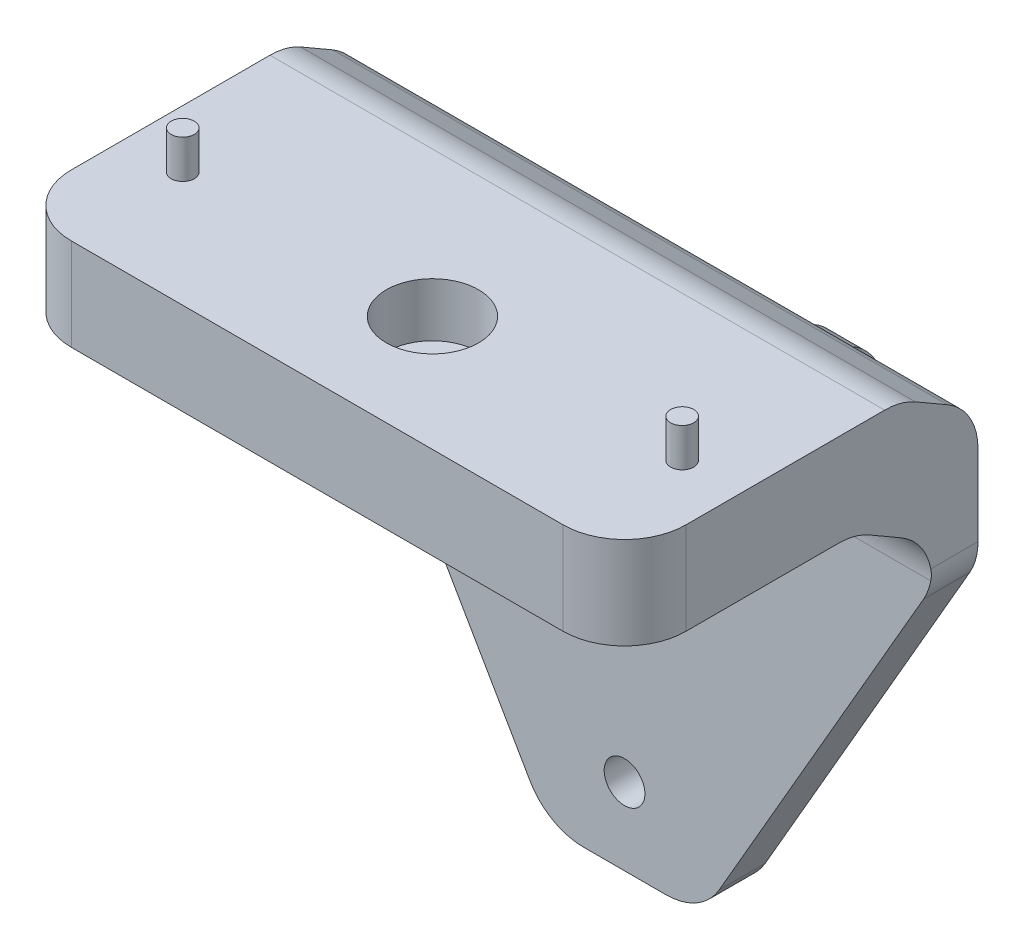
ISO-10303-21;
HEADER;
FILE_DESCRIPTION(('STEP AP214'),'2;1');
FILE_NAME('part.step','',(''),(''),'','','');
FILE_SCHEMA(('AUTOMOTIVE_DESIGN { 1 0 10303 214 1 1 1 1 }'));
ENDSEC;
DATA;
#1=APPLICATION_CONTEXT('core data for automotive mechanical design processes');
#2=APPLICATION_PROTOCOL_DEFINITION('international standard','automotive_design',2000,#1);
#3=PRODUCT_CONTEXT('',#1,'mechanical');
#4=PRODUCT('Part','Part','',(#3));
#5=PRODUCT_RELATED_PRODUCT_CATEGORY('part','',(#4));
#6=PRODUCT_DEFINITION_FORMATION('','',#4);
#7=PRODUCT_DEFINITION_CONTEXT('part definition',#1,'design');
#8=PRODUCT_DEFINITION('design','',#6,#7);
#9=PRODUCT_DEFINITION_SHAPE('','',#8);
#10=(LENGTH_UNIT() NAMED_UNIT(*) SI_UNIT(.MILLI.,.METRE.));
#11=(NAMED_UNIT(*) PLANE_ANGLE_UNIT() SI_UNIT($,.RADIAN.));
#12=(NAMED_UNIT(*) SI_UNIT($,.STERADIAN.) SOLID_ANGLE_UNIT());
#13=UNCERTAINTY_MEASURE_WITH_UNIT(LENGTH_MEASURE(1.E-05),#10,'distance_accuracy_value','');
#14=(GEOMETRIC_REPRESENTATION_CONTEXT(3) GLOBAL_UNCERTAINTY_ASSIGNED_CONTEXT((#13)) GLOBAL_UNIT_ASSIGNED_CONTEXT((#10,
#11,#12)) REPRESENTATION_CONTEXT('',''));
#15=CARTESIAN_POINT('',(0.,0.,0.));
#16=DIRECTION('',(0.,0.,1.));
#17=DIRECTION('',(1.,0.,0.));
#18=AXIS2_PLACEMENT_3D('',#15,#16,#17);
#19=CARTESIAN_POINT('',(40.,-63.,-46.));
#20=DIRECTION('',(0.,0.,1.));
#21=DIRECTION('',(1.,0.,0.));
#22=AXIS2_PLACEMENT_3D('',#19,#20,#21);
#23=PLANE('',#22);
#24=DIRECTION('',(0.500000000000001,-0.866025403784438,0.));
#25=VECTOR('',#24,1.);
#26=CARTESIAN_POINT('',(-9.99999999999993,-63.,-46.));
#27=LINE('',#26,#25);
#28=CARTESIAN_POINT('',(-12.3094010767584,-59.,-46.));
#29=VERTEX_POINT('',#28);
#30=CARTESIAN_POINT('',(-38.9282032302755,-12.8948822334847,-46.));
#31=VERTEX_POINT('',#30);
#32=EDGE_CURVE('E328',#29,#31,#27,.F.);
#33=ORIENTED_EDGE('',*,*,#32,.T.);
#34=CARTESIAN_POINT('',(-32.,-8.89488223348473,-46.));
#35=DIRECTION('',(0.,0.,1.));
#36=DIRECTION('',(1.,0.,0.));
#37=AXIS2_PLACEMENT_3D('',#34,#35,#36);
#38=CIRCLE('',#37,8.);
#39=CARTESIAN_POINT('',(-40.,-8.89488223348473,-46.));
#40=VERTEX_POINT('',#39);
#41=EDGE_CURVE('E648',#31,#40,#38,.F.);
#42=ORIENTED_EDGE('',*,*,#41,.T.);
#43=DIRECTION('',(0.,1.,0.));
#44=VECTOR('',#43,1.);
#45=CARTESIAN_POINT('',(-40.,-63.,-46.));
#46=LINE('',#45,#44);
#47=CARTESIAN_POINT('',(-40.,1.60769515458671,-46.));
#48=VERTEX_POINT('',#47);
#49=EDGE_CURVE('E300',#40,#48,#46,.T.);
#50=ORIENTED_EDGE('',*,*,#49,.T.);
#51=DIRECTION('',(-1.,0.,0.));
#52=VECTOR('',#51,1.);
#53=CARTESIAN_POINT('',(40.,1.60769515458671,-46.));
#54=LINE('',#53,#52);
#55=CARTESIAN_POINT('',(40.,1.60769515458671,-46.));
#56=VERTEX_POINT('',#55);
#57=EDGE_CURVE('E393',#48,#56,#54,.F.);
#58=ORIENTED_EDGE('',*,*,#57,.T.);
#59=DIRECTION('',(0.,1.,0.));
#60=VECTOR('',#59,1.);
#61=CARTESIAN_POINT('',(40.,-63.,-46.));
#62=LINE('',#61,#60);
#63=CARTESIAN_POINT('',(40.,-8.89488223348472,-46.));
#64=VERTEX_POINT('',#63);
#65=EDGE_CURVE('E289',#64,#56,#62,.T.);
#66=ORIENTED_EDGE('',*,*,#65,.F.);
#67=CARTESIAN_POINT('',(32.,-8.89488223348473,-46.));
#68=DIRECTION('',(0.,0.,1.));
#69=DIRECTION('',(1.,0.,0.));
#70=AXIS2_PLACEMENT_3D('',#67,#68,#69);
#71=CIRCLE('',#70,8.);
#72=CARTESIAN_POINT('',(38.9282032302755,-12.8948822334847,-46.));
#73=VERTEX_POINT('',#72);
#74=EDGE_CURVE('E654',#64,#73,#71,.F.);
#75=ORIENTED_EDGE('',*,*,#74,.T.);
#76=DIRECTION('',(-0.500000000000001,-0.866025403784438,0.));
#77=VECTOR('',#76,1.);
#78=CARTESIAN_POINT('',(40.,-11.0384757729337,-46.));
#79=LINE('',#78,#77);
#80=CARTESIAN_POINT('',(12.3094010767584,-59.,-46.));
#81=VERTEX_POINT('',#80);
#82=EDGE_CURVE('E321',#73,#81,#79,.T.);
#83=ORIENTED_EDGE('',*,*,#82,.T.);
#84=CARTESIAN_POINT('',(5.38119784648292,-55.,-46.));
#85=DIRECTION('',(0.,0.,1.));
#86=DIRECTION('',(1.,0.,0.));
#87=AXIS2_PLACEMENT_3D('',#84,#85,#86);
#88=CIRCLE('',#87,8.);
#89=CARTESIAN_POINT('',(5.38119784648292,-63.,-46.));
#90=VERTEX_POINT('',#89);
#91=EDGE_CURVE('E663',#81,#90,#88,.F.);
#92=ORIENTED_EDGE('',*,*,#91,.T.);
#93=DIRECTION('',(-1.,0.,0.));
#94=VECTOR('',#93,1.);
#95=CARTESIAN_POINT('',(40.,-63.,-46.));
#96=LINE('',#95,#94);
#97=CARTESIAN_POINT('',(-5.38119784648293,-63.,-46.));
#98=VERTEX_POINT('',#97);
#99=EDGE_CURVE('E309',#90,#98,#96,.T.);
#100=ORIENTED_EDGE('',*,*,#99,.T.);
#101=CARTESIAN_POINT('',(-5.38119784648293,-55.,-46.));
#102=DIRECTION('',(0.,0.,1.));
#103=DIRECTION('',(1.,0.,0.));
#104=AXIS2_PLACEMENT_3D('',#101,#102,#103);
#105=CIRCLE('',#104,8.);
#106=EDGE_CURVE('E668',#98,#29,#105,.F.);
#107=ORIENTED_EDGE('',*,*,#106,.T.);
#108=EDGE_LOOP('',(#33,#42,#50,#58,#66,#75,#83,#92,#100,#107));
#109=FACE_BOUND('',#108,.T.);
#110=CARTESIAN_POINT('',(0.,-25.,-46.));
#111=DIRECTION('',(0.,0.,1.));
#112=DIRECTION('',(1.,0.,0.));
#113=AXIS2_PLACEMENT_3D('',#110,#111,#112);
#114=CIRCLE('',#113,2.65);
#115=CARTESIAN_POINT('',(2.65,-25.,-46.));
#116=VERTEX_POINT('',#115);
#117=EDGE_CURVE('E262',#116,#116,#114,.F.);
#118=ORIENTED_EDGE('',*,*,#117,.F.);
#119=EDGE_LOOP('',(#118));
#120=FACE_BOUND('',#119,.T.);
#121=CARTESIAN_POINT('',(0.,-53.,-46.));
#122=DIRECTION('',(0.,0.,1.));
#123=DIRECTION('',(1.,0.,0.));
#124=AXIS2_PLACEMENT_3D('',#121,#122,#123);
#125=CIRCLE('',#124,2.65);
#126=CARTESIAN_POINT('',(2.65,-53.,-46.));
#127=VERTEX_POINT('',#126);
#128=EDGE_CURVE('E261',#127,#127,#125,.F.);
#129=ORIENTED_EDGE('',*,*,#128,.F.);
#130=EDGE_LOOP('',(#129));
#131=FACE_BOUND('',#130,.T.);
#132=DIRECTION('',(0.,1.,0.));
#133=VECTOR('',#132,1.);
#134=CARTESIAN_POINT('',(12.7,0.,-46.));
#135=LINE('',#134,#133);
#136=CARTESIAN_POINT('',(12.7,-40.,-46.));
#137=VERTEX_POINT('',#136);
#138=CARTESIAN_POINT('',(12.7,0.,-46.));
#139=VERTEX_POINT('',#138);
#140=EDGE_CURVE('E218',#137,#139,#135,.T.);
#141=ORIENTED_EDGE('',*,*,#140,.F.);
#142=DIRECTION('',(-1.,0.,0.));
#143=VECTOR('',#142,1.);
#144=CARTESIAN_POINT('',(12.7,-40.,-46.));
#145=LINE('',#144,#143);
#146=CARTESIAN_POINT('',(17.7,-40.,-46.));
#147=VERTEX_POINT('',#146);
#148=EDGE_CURVE('E229',#147,#137,#145,.T.);
#149=ORIENTED_EDGE('',*,*,#148,.F.);
#150=DIRECTION('',(0.,-1.,0.));
#151=VECTOR('',#150,1.);
#152=CARTESIAN_POINT('',(17.7,0.,-46.));
#153=LINE('',#152,#151);
#154=CARTESIAN_POINT('',(17.7,0.,-46.));
#155=VERTEX_POINT('',#154);
#156=EDGE_CURVE('E239',#155,#147,#153,.T.);
#157=ORIENTED_EDGE('',*,*,#156,.F.);
#158=DIRECTION('',(1.,0.,0.));
#159=VECTOR('',#158,1.);
#160=CARTESIAN_POINT('',(12.7,0.,-46.));
#161=LINE('',#160,#159);
#162=EDGE_CURVE('E232',#139,#155,#161,.T.);
#163=ORIENTED_EDGE('',*,*,#162,.F.);
#164=EDGE_LOOP('',(#141,#149,#157,#163));
#165=FACE_BOUND('',#164,.T.);
#166=ADVANCED_FACE('F40',(#109,#120,#131,#165),#23,.F.);
#167=CARTESIAN_POINT('',(0.,19.4953318805774,-15.));
#168=DIRECTION('',(0.,-1.,0.));
#169=DIRECTION('',(0.,0.,-1.));
#170=AXIS2_PLACEMENT_3D('',#167,#168,#169);
#171=CYLINDRICAL_SURFACE('',#170,2.65);
#172=CARTESIAN_POINT('',(0.,0.,-15.));
#173=DIRECTION('',(0.,-1.,0.));
#174=DIRECTION('',(0.,0.,-1.));
#175=AXIS2_PLACEMENT_3D('',#172,#173,#174);
#176=CIRCLE('',#175,2.65);
#177=CARTESIAN_POINT('',(0.,0.,-17.65));
#178=VERTEX_POINT('',#177);
#179=EDGE_CURVE('E281',#178,#178,#176,.T.);
#180=ORIENTED_EDGE('',*,*,#179,.T.);
#181=EDGE_LOOP('',(#180));
#182=FACE_BOUND('',#181,.T.);
#183=CARTESIAN_POINT('',(0.,5.,-15.));
#184=DIRECTION('',(0.,1.,0.));
#185=DIRECTION('',(0.,0.,1.));
#186=AXIS2_PLACEMENT_3D('',#183,#184,#185);
#187=CIRCLE('',#186,2.65);
#188=CARTESIAN_POINT('',(0.,5.,-12.35));
#189=VERTEX_POINT('',#188);
#190=EDGE_CURVE('E277',#189,#189,#187,.F.);
#191=ORIENTED_EDGE('',*,*,#190,.F.);
#192=EDGE_LOOP('',(#191));
#193=FACE_BOUND('',#192,.T.);
#194=ADVANCED_FACE('F469',(#182,#193),#171,.F.);
#195=CARTESIAN_POINT('',(40.,12.,0.));
#196=DIRECTION('',(0.,0.,-1.));
#197=DIRECTION('',(0.,1.,0.));
#198=AXIS2_PLACEMENT_3D('',#195,#196,#197);
#199=PLANE('',#198);
#200=DIRECTION('',(-1.,0.,0.));
#201=VECTOR('',#200,1.);
#202=CARTESIAN_POINT('',(40.,12.,0.));
#203=LINE('',#202,#201);
#204=CARTESIAN_POINT('',(32.,12.,0.));
#205=VERTEX_POINT('',#204);
#206=CARTESIAN_POINT('',(-32.,12.,0.));
#207=VERTEX_POINT('',#206);
#208=EDGE_CURVE('E297',#205,#207,#203,.T.);
#209=ORIENTED_EDGE('',*,*,#208,.T.);
#210=DIRECTION('',(0.,-1.,0.));
#211=VECTOR('',#210,1.);
#212=CARTESIAN_POINT('',(-32.,12.,0.));
#213=LINE('',#212,#211);
#214=CARTESIAN_POINT('',(-32.,0.,0.));
#215=VERTEX_POINT('',#214);
#216=EDGE_CURVE('E629',#207,#215,#213,.T.);
#217=ORIENTED_EDGE('',*,*,#216,.T.);
#218=DIRECTION('',(-1.,0.,0.));
#219=VECTOR('',#218,1.);
#220=CARTESIAN_POINT('',(40.,0.,0.));
#221=LINE('',#220,#219);
#222=CARTESIAN_POINT('',(32.,0.,0.));
#223=VERTEX_POINT('',#222);
#224=EDGE_CURVE('E317',#223,#215,#221,.T.);
#225=ORIENTED_EDGE('',*,*,#224,.F.);
#226=DIRECTION('',(0.,-1.,0.));
#227=VECTOR('',#226,1.);
#228=CARTESIAN_POINT('',(32.,12.,0.));
#229=LINE('',#228,#227);
#230=EDGE_CURVE('E631',#223,#205,#229,.F.);
#231=ORIENTED_EDGE('',*,*,#230,.T.);
#232=EDGE_LOOP('',(#209,#217,#225,#231));
#233=FACE_BOUND('',#232,.T.);
#234=ADVANCED_FACE('F475',(#233),#199,.F.);
#235=CARTESIAN_POINT('',(40.,0.,0.));
#236=DIRECTION('',(0.,1.,0.));
#237=DIRECTION('',(0.,0.,1.));
#238=AXIS2_PLACEMENT_3D('',#235,#236,#237);
#239=PLANE('',#238);
#240=ORIENTED_EDGE('',*,*,#179,.F.);
#241=EDGE_LOOP('',(#240));
#242=FACE_BOUND('',#241,.T.);
#243=ORIENTED_EDGE('',*,*,#224,.T.);
#244=CARTESIAN_POINT('',(-32.,0.,-8.));
#245=DIRECTION('',(0.,1.,0.));
#246=DIRECTION('',(0.,0.,1.));
#247=AXIS2_PLACEMENT_3D('',#244,#245,#246);
#248=CIRCLE('',#247,8.);
#249=CARTESIAN_POINT('',(-40.,0.,-8.));
#250=VERTEX_POINT('',#249);
#251=EDGE_CURVE('E548',#215,#250,#248,.F.);
#252=ORIENTED_EDGE('',*,*,#251,.T.);
#253=DIRECTION('',(0.,0.,-1.));
#254=VECTOR('',#253,1.);
#255=CARTESIAN_POINT('',(-40.,0.,0.));
#256=LINE('',#255,#254);
#257=CARTESIAN_POINT('',(-40.,0.,-27.8564064605511));
#258=VERTEX_POINT('',#257);
#259=EDGE_CURVE('E285',#250,#258,#256,.T.);
#260=ORIENTED_EDGE('',*,*,#259,.T.);
#261=DIRECTION('',(-1.,0.,0.));
#262=VECTOR('',#261,1.);
#263=CARTESIAN_POINT('',(40.,0.,-27.8564064605511));
#264=LINE('',#263,#262);
#265=CARTESIAN_POINT('',(40.,0.,-27.8564064605511));
#266=VERTEX_POINT('',#265);
#267=EDGE_CURVE('E366',#258,#266,#264,.F.);
#268=ORIENTED_EDGE('',*,*,#267,.T.);
#269=DIRECTION('',(0.,0.,-1.));
#270=VECTOR('',#269,1.);
#271=CARTESIAN_POINT('',(40.,0.,0.));
#272=LINE('',#271,#270);
#273=CARTESIAN_POINT('',(40.,0.,-8.));
#274=VERTEX_POINT('',#273);
#275=EDGE_CURVE('E286',#274,#266,#272,.T.);
#276=ORIENTED_EDGE('',*,*,#275,.F.);
#277=CARTESIAN_POINT('',(32.,0.,-8.));
#278=DIRECTION('',(0.,1.,0.));
#279=DIRECTION('',(0.,0.,1.));
#280=AXIS2_PLACEMENT_3D('',#277,#278,#279);
#281=CIRCLE('',#280,8.);
#282=EDGE_CURVE('E554',#274,#223,#281,.F.);
#283=ORIENTED_EDGE('',*,*,#282,.T.);
#284=EDGE_LOOP('',(#243,#252,#260,#268,#276,#283));
#285=FACE_BOUND('',#284,.T.);
#286=ADVANCED_FACE('F490',(#242,#285),#239,.F.);
#287=CARTESIAN_POINT('',(40.,0.,-40.));
#288=DIRECTION('',(0.,0.,-1.));
#289=DIRECTION('',(0.,1.,0.));
#290=AXIS2_PLACEMENT_3D('',#287,#288,#289);
#291=PLANE('',#290);
#292=CARTESIAN_POINT('',(0.,-53.,-40.));
#293=DIRECTION('',(0.,0.,1.));
#294=DIRECTION('',(1.,0.,0.));
#295=AXIS2_PLACEMENT_3D('',#292,#293,#294);
#296=CIRCLE('',#295,2.65);
#297=CARTESIAN_POINT('',(2.65,-53.,-40.));
#298=VERTEX_POINT('',#297);
#299=EDGE_CURVE('E257',#298,#298,#296,.T.);
#300=ORIENTED_EDGE('',*,*,#299,.F.);
#301=EDGE_LOOP('',(#300));
#302=FACE_BOUND('',#301,.T.);
#303=CARTESIAN_POINT('',(0.,-25.,-40.));
#304=DIRECTION('',(0.,0.,1.));
#305=DIRECTION('',(1.,0.,0.));
#306=AXIS2_PLACEMENT_3D('',#303,#304,#305);
#307=CIRCLE('',#306,2.65);
#308=CARTESIAN_POINT('',(2.65,-25.,-40.));
#309=VERTEX_POINT('',#308);
#310=EDGE_CURVE('E256',#309,#309,#307,.T.);
#311=ORIENTED_EDGE('',*,*,#310,.F.);
#312=EDGE_LOOP('',(#311));
#313=FACE_BOUND('',#312,.T.);
#314=DIRECTION('',(1.,0.,0.));
#315=VECTOR('',#314,1.);
#316=CARTESIAN_POINT('',(-40.,-10.3923048454133,-40.));
#317=LINE('',#316,#315);
#318=CARTESIAN_POINT('',(39.858608370525,-10.3923048454133,-40.));
#319=VERTEX_POINT('',#318);
#320=CARTESIAN_POINT('',(-39.858608370525,-10.3923048454133,-40.));
#321=VERTEX_POINT('',#320);
#322=EDGE_CURVE('E356',#319,#321,#317,.F.);
#323=ORIENTED_EDGE('',*,*,#322,.T.);
#324=CARTESIAN_POINT('',(-32.,-8.89488223348473,-40.));
#325=DIRECTION('',(0.,0.,-1.));
#326=DIRECTION('',(0.,1.,0.));
#327=AXIS2_PLACEMENT_3D('',#324,#325,#326);
#328=CIRCLE('',#327,8.);
#329=CARTESIAN_POINT('',(-38.9282032302755,-12.8948822334847,-40.));
#330=VERTEX_POINT('',#329);
#331=EDGE_CURVE('E680',#321,#330,#328,.F.);
#332=ORIENTED_EDGE('',*,*,#331,.T.);
#333=DIRECTION('',(-0.500000000000001,0.866025403784438,0.));
#334=VECTOR('',#333,1.);
#335=CARTESIAN_POINT('',(-9.99999999999993,-63.,-40.));
#336=LINE('',#335,#334);
#337=CARTESIAN_POINT('',(-12.3094010767584,-59.,-40.));
#338=VERTEX_POINT('',#337);
#339=EDGE_CURVE('E336',#330,#338,#336,.F.);
#340=ORIENTED_EDGE('',*,*,#339,.T.);
#341=CARTESIAN_POINT('',(-5.38119784648293,-55.,-40.));
#342=DIRECTION('',(0.,0.,-1.));
#343=DIRECTION('',(0.,1.,0.));
#344=AXIS2_PLACEMENT_3D('',#341,#342,#343);
#345=CIRCLE('',#344,8.);
#346=CARTESIAN_POINT('',(-5.38119784648293,-63.,-40.));
#347=VERTEX_POINT('',#346);
#348=EDGE_CURVE('E688',#338,#347,#345,.F.);
#349=ORIENTED_EDGE('',*,*,#348,.T.);
#350=DIRECTION('',(-1.,0.,0.));
#351=VECTOR('',#350,1.);
#352=CARTESIAN_POINT('',(40.,-63.,-40.));
#353=LINE('',#352,#351);
#354=CARTESIAN_POINT('',(5.38119784648292,-63.,-40.));
#355=VERTEX_POINT('',#354);
#356=EDGE_CURVE('E313',#355,#347,#353,.T.);
#357=ORIENTED_EDGE('',*,*,#356,.F.);
#358=CARTESIAN_POINT('',(5.38119784648292,-55.,-40.));
#359=DIRECTION('',(0.,0.,-1.));
#360=DIRECTION('',(0.,1.,0.));
#361=AXIS2_PLACEMENT_3D('',#358,#359,#360);
#362=CIRCLE('',#361,8.);
#363=CARTESIAN_POINT('',(12.3094010767584,-59.,-40.));
#364=VERTEX_POINT('',#363);
#365=EDGE_CURVE('E686',#355,#364,#362,.F.);
#366=ORIENTED_EDGE('',*,*,#365,.T.);
#367=DIRECTION('',(0.500000000000001,0.866025403784438,0.));
#368=VECTOR('',#367,1.);
#369=CARTESIAN_POINT('',(40.,-11.0384757729337,-40.));
#370=LINE('',#369,#368);
#371=CARTESIAN_POINT('',(38.9282032302755,-12.8948822334847,-40.));
#372=VERTEX_POINT('',#371);
#373=EDGE_CURVE('E332',#364,#372,#370,.T.);
#374=ORIENTED_EDGE('',*,*,#373,.T.);
#375=CARTESIAN_POINT('',(32.,-8.89488223348473,-40.));
#376=DIRECTION('',(0.,0.,-1.));
#377=DIRECTION('',(0.,1.,0.));
#378=AXIS2_PLACEMENT_3D('',#375,#376,#377);
#379=CIRCLE('',#378,8.);
#380=EDGE_CURVE('E683',#372,#319,#379,.F.);
#381=ORIENTED_EDGE('',*,*,#380,.T.);
#382=EDGE_LOOP('',(#323,#332,#340,#349,#357,#366,#374,#381));
#383=FACE_BOUND('',#382,.T.);
#384=ADVANCED_FACE('F486',(#302,#313,#383),#291,.F.);
#385=CARTESIAN_POINT('',(40.,-63.,-40.));
#386=DIRECTION('',(0.,1.,0.));
#387=DIRECTION('',(0.,0.,1.));
#388=AXIS2_PLACEMENT_3D('',#385,#386,#387);
#389=PLANE('',#388);
#390=ORIENTED_EDGE('',*,*,#99,.F.);
#391=DIRECTION('',(0.,0.,1.));
#392=VECTOR('',#391,1.);
#393=CARTESIAN_POINT('',(5.38119784648292,-63.,-40.));
#394=LINE('',#393,#392);
#395=EDGE_CURVE('E561',#90,#355,#394,.T.);
#396=ORIENTED_EDGE('',*,*,#395,.T.);
#397=ORIENTED_EDGE('',*,*,#356,.T.);
#398=DIRECTION('',(0.,0.,1.));
#399=VECTOR('',#398,1.);
#400=CARTESIAN_POINT('',(-5.38119784648293,-63.,-46.));
#401=LINE('',#400,#399);
#402=EDGE_CURVE('E552',#347,#98,#401,.F.);
#403=ORIENTED_EDGE('',*,*,#402,.T.);
#404=EDGE_LOOP('',(#390,#396,#397,#403));
#405=FACE_BOUND('',#404,.T.);
#406=ADVANCED_FACE('F483',(#405),#389,.F.);
#407=CARTESIAN_POINT('',(40.,12.,-46.));
#408=DIRECTION('',(0.,-1.,0.));
#409=DIRECTION('',(0.,0.,-1.));
#410=AXIS2_PLACEMENT_3D('',#407,#408,#409);
#411=PLANE('',#410);
#412=CARTESIAN_POINT('',(32.5,12.,-15.));
#413=DIRECTION('',(0.,-1.,0.));
#414=DIRECTION('',(0.,0.,-1.));
#415=AXIS2_PLACEMENT_3D('',#412,#413,#414);
#416=CIRCLE('',#415,1.5);
#417=CARTESIAN_POINT('',(32.5,12.,-16.5));
#418=VERTEX_POINT('',#417);
#419=EDGE_CURVE('E569',#418,#418,#416,.F.);
#420=ORIENTED_EDGE('',*,*,#419,.F.);
#421=EDGE_LOOP('',(#420));
#422=FACE_BOUND('',#421,.T.);
#423=CARTESIAN_POINT('',(-32.5,12.,-15.));
#424=DIRECTION('',(0.,-1.,0.));
#425=DIRECTION('',(0.,0.,-1.));
#426=AXIS2_PLACEMENT_3D('',#423,#424,#425);
#427=CIRCLE('',#426,1.5);
#428=CARTESIAN_POINT('',(-32.5,12.,-16.5));
#429=VERTEX_POINT('',#428);
#430=EDGE_CURVE('E565',#429,#429,#427,.F.);
#431=ORIENTED_EDGE('',*,*,#430,.F.);
#432=EDGE_LOOP('',(#431));
#433=FACE_BOUND('',#432,.T.);
#434=CARTESIAN_POINT('',(0.,12.,-15.));
#435=DIRECTION('',(0.,1.,0.));
#436=DIRECTION('',(0.,0.,1.));
#437=AXIS2_PLACEMENT_3D('',#434,#435,#436);
#438=CIRCLE('',#437,6.);
#439=CARTESIAN_POINT('',(0.,12.,-9.));
#440=VERTEX_POINT('',#439);
#441=EDGE_CURVE('E266',#440,#440,#438,.T.);
#442=ORIENTED_EDGE('',*,*,#441,.F.);
#443=EDGE_LOOP('',(#442));
#444=FACE_BOUND('',#443,.T.);
#445=DIRECTION('',(0.,0.,1.));
#446=VECTOR('',#445,1.);
#447=CARTESIAN_POINT('',(-40.,12.,-46.));
#448=LINE('',#447,#446);
#449=CARTESIAN_POINT('',(-40.,12.,-33.856406460551));
#450=VERTEX_POINT('',#449);
#451=CARTESIAN_POINT('',(-40.,12.,-8.));
#452=VERTEX_POINT('',#451);
#453=EDGE_CURVE('E290',#450,#452,#448,.T.);
#454=ORIENTED_EDGE('',*,*,#453,.T.);
#455=CARTESIAN_POINT('',(-32.,12.,-8.));
#456=DIRECTION('',(0.,-1.,0.));
#457=DIRECTION('',(0.,0.,-1.));
#458=AXIS2_PLACEMENT_3D('',#455,#456,#457);
#459=CIRCLE('',#458,8.);
#460=EDGE_CURVE('E547',#452,#207,#459,.F.);
#461=ORIENTED_EDGE('',*,*,#460,.T.);
#462=ORIENTED_EDGE('',*,*,#208,.F.);
#463=CARTESIAN_POINT('',(32.,12.,-8.));
#464=DIRECTION('',(0.,-1.,0.));
#465=DIRECTION('',(0.,0.,-1.));
#466=AXIS2_PLACEMENT_3D('',#463,#464,#465);
#467=CIRCLE('',#466,8.);
#468=CARTESIAN_POINT('',(40.,12.,-8.));
#469=VERTEX_POINT('',#468);
#470=EDGE_CURVE('E543',#205,#469,#467,.F.);
#471=ORIENTED_EDGE('',*,*,#470,.T.);
#472=DIRECTION('',(0.,0.,1.));
#473=VECTOR('',#472,1.);
#474=CARTESIAN_POINT('',(40.,12.,-46.));
#475=LINE('',#474,#473);
#476=CARTESIAN_POINT('',(40.,12.,-33.856406460551));
#477=VERTEX_POINT('',#476);
#478=EDGE_CURVE('E293',#477,#469,#475,.T.);
#479=ORIENTED_EDGE('',*,*,#478,.F.);
#480=DIRECTION('',(1.,0.,0.));
#481=VECTOR('',#480,1.);
#482=CARTESIAN_POINT('',(-40.,12.,-33.856406460551));
#483=LINE('',#482,#481);
#484=EDGE_CURVE('E370',#477,#450,#483,.F.);
#485=ORIENTED_EDGE('',*,*,#484,.T.);
#486=EDGE_LOOP('',(#454,#461,#462,#471,#479,#485));
#487=FACE_BOUND('',#486,.T.);
#488=ADVANCED_FACE('F481',(#422,#433,#444,#487),#411,.F.);
#489=CARTESIAN_POINT('',(40.,0.,0.));
#490=DIRECTION('',(1.,0.,0.));
#491=DIRECTION('',(0.,0.,-1.));
#492=AXIS2_PLACEMENT_3D('',#489,#490,#491);
#493=PLANE('',#492);
#494=CARTESIAN_POINT('',(40.,-10.3923048454133,-32.));
#495=DIRECTION('',(1.,0.,0.));
#496=DIRECTION('',(0.,0.,-1.));
#497=AXIS2_PLACEMENT_3D('',#494,#495,#496);
#498=CIRCLE('',#497,8.);
#499=CARTESIAN_POINT('',(40.,-3.46410161513777,-36.));
#500=VERTEX_POINT('',#499);
#501=CARTESIAN_POINT('',(40.,-8.89488223348473,-39.858608370525));
#502=VERTEX_POINT('',#501);
#503=EDGE_CURVE('E400',#500,#502,#498,.F.);
#504=ORIENTED_EDGE('',*,*,#503,.T.);
#505=DIRECTION('',(0.,0.,-1.));
#506=VECTOR('',#505,1.);
#507=CARTESIAN_POINT('',(40.,-8.89488223348473,0.));
#508=LINE('',#507,#506);
#509=EDGE_CURVE('E647',#502,#64,#508,.T.);
#510=ORIENTED_EDGE('',*,*,#509,.T.);
#511=ORIENTED_EDGE('',*,*,#65,.T.);
#512=CARTESIAN_POINT('',(40.,1.60769515458671,-38.));
#513=DIRECTION('',(1.,0.,0.));
#514=DIRECTION('',(0.,0.,-1.));
#515=AXIS2_PLACEMENT_3D('',#512,#513,#514);
#516=CIRCLE('',#515,8.);
#517=CARTESIAN_POINT('',(40.,8.53589838486223,-42.));
#518=VERTEX_POINT('',#517);
#519=EDGE_CURVE('E387',#56,#518,#516,.T.);
#520=ORIENTED_EDGE('',*,*,#519,.T.);
#521=DIRECTION('',(0.,-0.499999999999998,-0.86602540378444));
#522=VECTOR('',#521,1.);
#523=CARTESIAN_POINT('',(40.,24.5884572681198,-14.1961524227065));
#524=LINE('',#523,#522);
#525=CARTESIAN_POINT('',(40.,10.9282032302755,-37.856406460551));
#526=VERTEX_POINT('',#525);
#527=EDGE_CURVE('E344',#518,#526,#524,.F.);
#528=ORIENTED_EDGE('',*,*,#527,.T.);
#529=CARTESIAN_POINT('',(40.,4.,-33.856406460551));
#530=DIRECTION('',(1.,0.,0.));
#531=DIRECTION('',(0.,0.,-1.));
#532=AXIS2_PLACEMENT_3D('',#529,#530,#531);
#533=CIRCLE('',#532,8.);
#534=EDGE_CURVE('E390',#526,#477,#533,.T.);
#535=ORIENTED_EDGE('',*,*,#534,.T.);
#536=ORIENTED_EDGE('',*,*,#478,.T.);
#537=DIRECTION('',(0.,-1.,0.));
#538=VECTOR('',#537,1.);
#539=CARTESIAN_POINT('',(40.,0.,-8.));
#540=LINE('',#539,#538);
#541=EDGE_CURVE('E644',#469,#274,#540,.T.);
#542=ORIENTED_EDGE('',*,*,#541,.T.);
#543=ORIENTED_EDGE('',*,*,#275,.T.);
#544=CARTESIAN_POINT('',(40.,-8.,-27.8564064605511));
#545=DIRECTION('',(1.,0.,0.));
#546=DIRECTION('',(0.,0.,-1.));
#547=AXIS2_PLACEMENT_3D('',#544,#545,#546);
#548=CIRCLE('',#547,8.);
#549=CARTESIAN_POINT('',(40.,-1.07179676972451,-31.8564064605511));
#550=VERTEX_POINT('',#549);
#551=EDGE_CURVE('E404',#266,#550,#548,.F.);
#552=ORIENTED_EDGE('',*,*,#551,.T.);
#553=DIRECTION('',(0.,0.500000000000005,0.866025403784436));
#554=VECTOR('',#553,1.);
#555=CARTESIAN_POINT('',(40.,-5.77350269189628,-40.));
#556=LINE('',#555,#554);
#557=EDGE_CURVE('E352',#550,#500,#556,.F.);
#558=ORIENTED_EDGE('',*,*,#557,.T.);
#559=EDGE_LOOP('',(#504,#510,#511,#520,#528,#535,#536,#542,#543,#552,#558));
#560=FACE_BOUND('',#559,.T.);
#561=ADVANCED_FACE('F536',(#560),#493,.T.);
#562=CARTESIAN_POINT('',(-40.,0.,0.));
#563=DIRECTION('',(1.,0.,0.));
#564=DIRECTION('',(0.,0.,-1.));
#565=AXIS2_PLACEMENT_3D('',#562,#563,#564);
#566=PLANE('',#565);
#567=ORIENTED_EDGE('',*,*,#49,.F.);
#568=DIRECTION('',(0.,0.,-1.));
#569=VECTOR('',#568,1.);
#570=CARTESIAN_POINT('',(-40.,-8.89488223348473,-40.));
#571=LINE('',#570,#569);
#572=CARTESIAN_POINT('',(-40.,-8.89488223348473,-39.858608370525));
#573=VERTEX_POINT('',#572);
#574=EDGE_CURVE('E414',#40,#573,#571,.F.);
#575=ORIENTED_EDGE('',*,*,#574,.T.);
#576=CARTESIAN_POINT('',(-40.,-10.3923048454133,-32.));
#577=DIRECTION('',(1.,0.,0.));
#578=DIRECTION('',(0.,0.,-1.));
#579=AXIS2_PLACEMENT_3D('',#576,#577,#578);
#580=CIRCLE('',#579,8.);
#581=CARTESIAN_POINT('',(-40.,-3.46410161513778,-36.));
#582=VERTEX_POINT('',#581);
#583=EDGE_CURVE('E397',#573,#582,#580,.T.);
#584=ORIENTED_EDGE('',*,*,#583,.T.);
#585=DIRECTION('',(0.,-0.500000000000005,-0.866025403784436));
#586=VECTOR('',#585,1.);
#587=CARTESIAN_POINT('',(-40.,12.9903810567667,-7.50000000000015));
#588=LINE('',#587,#586);
#589=CARTESIAN_POINT('',(-40.,-1.07179676972452,-31.8564064605511));
#590=VERTEX_POINT('',#589);
#591=EDGE_CURVE('E348',#582,#590,#588,.F.);
#592=ORIENTED_EDGE('',*,*,#591,.T.);
#593=CARTESIAN_POINT('',(-40.,-8.,-27.8564064605511));
#594=DIRECTION('',(1.,0.,0.));
#595=DIRECTION('',(0.,0.,-1.));
#596=AXIS2_PLACEMENT_3D('',#593,#594,#595);
#597=CIRCLE('',#596,8.);
#598=EDGE_CURVE('E407',#590,#258,#597,.T.);
#599=ORIENTED_EDGE('',*,*,#598,.T.);
#600=ORIENTED_EDGE('',*,*,#259,.F.);
#601=DIRECTION('',(0.,-1.,0.));
#602=VECTOR('',#601,1.);
#603=CARTESIAN_POINT('',(-40.,0.,-8.));
#604=LINE('',#603,#602);
#605=EDGE_CURVE('E411',#250,#452,#604,.F.);
#606=ORIENTED_EDGE('',*,*,#605,.T.);
#607=ORIENTED_EDGE('',*,*,#453,.F.);
#608=CARTESIAN_POINT('',(-40.,4.,-33.856406460551));
#609=DIRECTION('',(1.,0.,0.));
#610=DIRECTION('',(0.,0.,-1.));
#611=AXIS2_PLACEMENT_3D('',#608,#609,#610);
#612=CIRCLE('',#611,8.);
#613=CARTESIAN_POINT('',(-40.,10.9282032302755,-37.8564064605509));
#614=VERTEX_POINT('',#613);
#615=EDGE_CURVE('E378',#450,#614,#612,.F.);
#616=ORIENTED_EDGE('',*,*,#615,.T.);
#617=DIRECTION('',(0.,0.499999999999998,0.86602540378444));
#618=VECTOR('',#617,1.);
#619=CARTESIAN_POINT('',(-40.,12.,-35.9999999999999));
#620=LINE('',#619,#618);
#621=CARTESIAN_POINT('',(-40.,8.53589838486223,-42.));
#622=VERTEX_POINT('',#621);
#623=EDGE_CURVE('E340',#614,#622,#620,.F.);
#624=ORIENTED_EDGE('',*,*,#623,.T.);
#625=CARTESIAN_POINT('',(-40.,1.60769515458671,-38.));
#626=DIRECTION('',(1.,0.,0.));
#627=DIRECTION('',(0.,0.,-1.));
#628=AXIS2_PLACEMENT_3D('',#625,#626,#627);
#629=CIRCLE('',#628,8.);
#630=EDGE_CURVE('E374',#622,#48,#629,.F.);
#631=ORIENTED_EDGE('',*,*,#630,.T.);
#632=EDGE_LOOP('',(#567,#575,#584,#592,#599,#600,#606,#607,#616,#624,#631));
#633=FACE_BOUND('',#632,.T.);
#634=ADVANCED_FACE('F715',(#633),#566,.F.);
#635=CARTESIAN_POINT('',(0.,5.,-15.));
#636=DIRECTION('',(0.,1.,0.));
#637=DIRECTION('',(0.,0.,1.));
#638=AXIS2_PLACEMENT_3D('',#635,#636,#637);
#639=PLANE('',#638);
#640=CARTESIAN_POINT('',(0.,5.,-15.));
#641=DIRECTION('',(0.,1.,0.));
#642=DIRECTION('',(0.,0.,1.));
#643=AXIS2_PLACEMENT_3D('',#640,#641,#642);
#644=CIRCLE('',#643,6.);
#645=CARTESIAN_POINT('',(0.,5.,-9.));
#646=VERTEX_POINT('',#645);
#647=EDGE_CURVE('E273',#646,#646,#644,.T.);
#648=ORIENTED_EDGE('',*,*,#647,.T.);
#649=EDGE_LOOP('',(#648));
#650=FACE_BOUND('',#649,.T.);
#651=ORIENTED_EDGE('',*,*,#190,.T.);
#652=EDGE_LOOP('',(#651));
#653=FACE_BOUND('',#652,.T.);
#654=ADVANCED_FACE('F719',(#650,#653),#639,.T.);
#655=CARTESIAN_POINT('',(0.,5.,-15.));
#656=DIRECTION('',(0.,1.,0.));
#657=DIRECTION('',(0.,0.,1.));
#658=AXIS2_PLACEMENT_3D('',#655,#656,#657);
#659=CYLINDRICAL_SURFACE('',#658,6.);
#660=ORIENTED_EDGE('',*,*,#647,.F.);
#661=EDGE_LOOP('',(#660));
#662=FACE_BOUND('',#661,.T.);
#663=ORIENTED_EDGE('',*,*,#441,.T.);
#664=EDGE_LOOP('',(#663));
#665=FACE_BOUND('',#664,.T.);
#666=ADVANCED_FACE('F724',(#662,#665),#659,.F.);
#667=CARTESIAN_POINT('',(0.,-25.,-46.001));
#668=DIRECTION('',(0.,0.,1.));
#669=DIRECTION('',(1.,0.,0.));
#670=AXIS2_PLACEMENT_3D('',#667,#668,#669);
#671=CYLINDRICAL_SURFACE('',#670,2.65);
#672=ORIENTED_EDGE('',*,*,#310,.T.);
#673=EDGE_LOOP('',(#672));
#674=FACE_BOUND('',#673,.T.);
#675=ORIENTED_EDGE('',*,*,#117,.T.);
#676=EDGE_LOOP('',(#675));
#677=FACE_BOUND('',#676,.T.);
#678=ADVANCED_FACE('F730',(#674,#677),#671,.F.);
#679=CARTESIAN_POINT('',(0.,-53.,-46.001));
#680=DIRECTION('',(0.,0.,1.));
#681=DIRECTION('',(1.,0.,0.));
#682=AXIS2_PLACEMENT_3D('',#679,#680,#681);
#683=CYLINDRICAL_SURFACE('',#682,2.65);
#684=ORIENTED_EDGE('',*,*,#299,.T.);
#685=EDGE_LOOP('',(#684));
#686=FACE_BOUND('',#685,.T.);
#687=ORIENTED_EDGE('',*,*,#128,.T.);
#688=EDGE_LOOP('',(#687));
#689=FACE_BOUND('',#688,.T.);
#690=ADVANCED_FACE('F506',(#686,#689),#683,.F.);
#691=CARTESIAN_POINT('',(-9.99999999999993,-63.,-40.));
#692=DIRECTION('',(0.866025403784438,0.500000000000001,0.));
#693=DIRECTION('',(0.,0.,-1.));
#694=AXIS2_PLACEMENT_3D('',#691,#692,#693);
#695=PLANE('',#694);
#696=ORIENTED_EDGE('',*,*,#339,.F.);
#697=DIRECTION('',(0.,0.,1.));
#698=VECTOR('',#697,1.);
#699=CARTESIAN_POINT('',(-38.9282032302755,-12.8948822334847,-46.));
#700=LINE('',#699,#698);
#701=EDGE_CURVE('E672',#330,#31,#700,.F.);
#702=ORIENTED_EDGE('',*,*,#701,.T.);
#703=ORIENTED_EDGE('',*,*,#32,.F.);
#704=DIRECTION('',(0.,0.,-1.));
#705=VECTOR('',#704,1.);
#706=CARTESIAN_POINT('',(-12.3094010767584,-59.,-40.));
#707=LINE('',#706,#705);
#708=EDGE_CURVE('E677',#29,#338,#707,.F.);
#709=ORIENTED_EDGE('',*,*,#708,.T.);
#710=EDGE_LOOP('',(#696,#702,#703,#709));
#711=FACE_BOUND('',#710,.T.);
#712=ADVANCED_FACE('F499',(#711),#695,.F.);
#713=CARTESIAN_POINT('',(40.,-11.0384757729337,0.));
#714=DIRECTION('',(0.866025403784438,-0.500000000000001,0.));
#715=DIRECTION('',(0.,0.,1.));
#716=AXIS2_PLACEMENT_3D('',#713,#714,#715);
#717=PLANE('',#716);
#718=ORIENTED_EDGE('',*,*,#82,.F.);
#719=DIRECTION('',(0.,0.,-1.));
#720=VECTOR('',#719,1.);
#721=CARTESIAN_POINT('',(38.9282032302755,-12.8948822334847,0.));
#722=LINE('',#721,#720);
#723=EDGE_CURVE('E633',#73,#372,#722,.F.);
#724=ORIENTED_EDGE('',*,*,#723,.T.);
#725=ORIENTED_EDGE('',*,*,#373,.F.);
#726=DIRECTION('',(0.,0.,1.));
#727=VECTOR('',#726,1.);
#728=CARTESIAN_POINT('',(12.3094010767584,-59.,-46.));
#729=LINE('',#728,#727);
#730=EDGE_CURVE('E638',#364,#81,#729,.F.);
#731=ORIENTED_EDGE('',*,*,#730,.T.);
#732=EDGE_LOOP('',(#718,#724,#725,#731));
#733=FACE_BOUND('',#732,.T.);
#734=ADVANCED_FACE('F505',(#733),#717,.T.);
#735=CARTESIAN_POINT('',(12.7,0.,-56.));
#736=DIRECTION('',(1.,0.,0.));
#737=DIRECTION('',(0.,1.,0.));
#738=AXIS2_PLACEMENT_3D('',#735,#736,#737);
#739=PLANE('',#738);
#740=DIRECTION('',(0.,1.,0.));
#741=VECTOR('',#740,1.);
#742=CARTESIAN_POINT('',(12.7,0.,-56.));
#743=LINE('',#742,#741);
#744=CARTESIAN_POINT('',(12.7,-32.,-56.));
#745=VERTEX_POINT('',#744);
#746=CARTESIAN_POINT('',(12.7,-8.,-56.));
#747=VERTEX_POINT('',#746);
#748=EDGE_CURVE('E238',#745,#747,#743,.T.);
#749=ORIENTED_EDGE('',*,*,#748,.F.);
#750=CARTESIAN_POINT('',(12.7,-32.,-48.));
#751=DIRECTION('',(1.,0.,0.));
#752=DIRECTION('',(0.,1.,0.));
#753=AXIS2_PLACEMENT_3D('',#750,#751,#752);
#754=CIRCLE('',#753,8.);
#755=CARTESIAN_POINT('',(12.7,-40.,-48.));
#756=VERTEX_POINT('',#755);
#757=EDGE_CURVE('E219',#745,#756,#754,.F.);
#758=ORIENTED_EDGE('',*,*,#757,.T.);
#759=DIRECTION('',(0.,0.,1.));
#760=VECTOR('',#759,1.);
#761=CARTESIAN_POINT('',(12.7,-40.,-56.));
#762=LINE('',#761,#760);
#763=EDGE_CURVE('E213',#756,#137,#762,.T.);
#764=ORIENTED_EDGE('',*,*,#763,.T.);
#765=ORIENTED_EDGE('',*,*,#140,.T.);
#766=DIRECTION('',(0.,0.,1.));
#767=VECTOR('',#766,1.);
#768=CARTESIAN_POINT('',(12.7,0.,-56.));
#769=LINE('',#768,#767);
#770=CARTESIAN_POINT('',(12.7,0.,-48.));
#771=VERTEX_POINT('',#770);
#772=EDGE_CURVE('E253',#771,#139,#769,.T.);
#773=ORIENTED_EDGE('',*,*,#772,.F.);
#774=CARTESIAN_POINT('',(12.7,-8.,-48.));
#775=DIRECTION('',(1.,0.,0.));
#776=DIRECTION('',(0.,1.,0.));
#777=AXIS2_PLACEMENT_3D('',#774,#775,#776);
#778=CIRCLE('',#777,8.);
#779=EDGE_CURVE('E581',#771,#747,#778,.F.);
#780=ORIENTED_EDGE('',*,*,#779,.T.);
#781=EDGE_LOOP('',(#749,#758,#764,#765,#773,#780));
#782=FACE_BOUND('',#781,.T.);
#783=ADVANCED_FACE('F216',(#782),#739,.F.);
#784=CARTESIAN_POINT('',(12.7,0.,-56.));
#785=DIRECTION('',(0.,-1.,0.));
#786=DIRECTION('',(1.,0.,0.));
#787=AXIS2_PLACEMENT_3D('',#784,#785,#786);
#788=PLANE('',#787);
#789=DIRECTION('',(0.,0.,1.));
#790=VECTOR('',#789,1.);
#791=CARTESIAN_POINT('',(17.7,0.,-56.));
#792=LINE('',#791,#790);
#793=CARTESIAN_POINT('',(17.7,0.,-48.));
#794=VERTEX_POINT('',#793);
#795=EDGE_CURVE('E250',#794,#155,#792,.T.);
#796=ORIENTED_EDGE('',*,*,#795,.F.);
#797=DIRECTION('',(1.,0.,0.));
#798=VECTOR('',#797,1.);
#799=CARTESIAN_POINT('',(12.7,0.,-48.));
#800=LINE('',#799,#798);
#801=EDGE_CURVE('E11',#794,#771,#800,.F.);
#802=ORIENTED_EDGE('',*,*,#801,.T.);
#803=ORIENTED_EDGE('',*,*,#772,.T.);
#804=ORIENTED_EDGE('',*,*,#162,.T.);
#805=EDGE_LOOP('',(#796,#802,#803,#804));
#806=FACE_BOUND('',#805,.T.);
#807=ADVANCED_FACE('F741',(#806),#788,.F.);
#808=CARTESIAN_POINT('',(17.7,0.,-56.));
#809=DIRECTION('',(-1.,0.,0.));
#810=DIRECTION('',(0.,-1.,0.));
#811=AXIS2_PLACEMENT_3D('',#808,#809,#810);
#812=PLANE('',#811);
#813=DIRECTION('',(0.,0.,1.));
#814=VECTOR('',#813,1.);
#815=CARTESIAN_POINT('',(17.7,-40.,-56.));
#816=LINE('',#815,#814);
#817=CARTESIAN_POINT('',(17.7,-40.,-48.));
#818=VERTEX_POINT('',#817);
#819=EDGE_CURVE('E222',#818,#147,#816,.T.);
#820=ORIENTED_EDGE('',*,*,#819,.F.);
#821=CARTESIAN_POINT('',(17.7,-32.,-48.));
#822=DIRECTION('',(-1.,0.,0.));
#823=DIRECTION('',(0.,-1.,0.));
#824=AXIS2_PLACEMENT_3D('',#821,#822,#823);
#825=CIRCLE('',#824,8.);
#826=CARTESIAN_POINT('',(17.7,-32.,-56.));
#827=VERTEX_POINT('',#826);
#828=EDGE_CURVE('E49',#818,#827,#825,.F.);
#829=ORIENTED_EDGE('',*,*,#828,.T.);
#830=DIRECTION('',(0.,-1.,0.));
#831=VECTOR('',#830,1.);
#832=CARTESIAN_POINT('',(17.7,0.,-56.));
#833=LINE('',#832,#831);
#834=CARTESIAN_POINT('',(17.7,-8.,-56.));
#835=VERTEX_POINT('',#834);
#836=EDGE_CURVE('E223',#835,#827,#833,.T.);
#837=ORIENTED_EDGE('',*,*,#836,.F.);
#838=CARTESIAN_POINT('',(17.7,-8.,-48.));
#839=DIRECTION('',(-1.,0.,0.));
#840=DIRECTION('',(0.,-1.,0.));
#841=AXIS2_PLACEMENT_3D('',#838,#839,#840);
#842=CIRCLE('',#841,8.);
#843=EDGE_CURVE('E56',#835,#794,#842,.F.);
#844=ORIENTED_EDGE('',*,*,#843,.T.);
#845=ORIENTED_EDGE('',*,*,#795,.T.);
#846=ORIENTED_EDGE('',*,*,#156,.T.);
#847=EDGE_LOOP('',(#820,#829,#837,#844,#845,#846));
#848=FACE_BOUND('',#847,.T.);
#849=ADVANCED_FACE('F592',(#848),#812,.F.);
#850=CARTESIAN_POINT('',(12.7,-40.,-56.));
#851=DIRECTION('',(0.,1.,0.));
#852=DIRECTION('',(0.,0.,1.));
#853=AXIS2_PLACEMENT_3D('',#850,#851,#852);
#854=PLANE('',#853);
#855=ORIENTED_EDGE('',*,*,#763,.F.);
#856=DIRECTION('',(-1.,0.,0.));
#857=VECTOR('',#856,1.);
#858=CARTESIAN_POINT('',(12.7,-40.,-48.));
#859=LINE('',#858,#857);
#860=EDGE_CURVE('E64',#756,#818,#859,.F.);
#861=ORIENTED_EDGE('',*,*,#860,.T.);
#862=ORIENTED_EDGE('',*,*,#819,.T.);
#863=ORIENTED_EDGE('',*,*,#148,.T.);
#864=EDGE_LOOP('',(#855,#861,#862,#863));
#865=FACE_BOUND('',#864,.T.);
#866=ADVANCED_FACE('F236',(#865),#854,.F.);
#867=CARTESIAN_POINT('',(0.,0.,-56.));
#868=DIRECTION('',(0.,0.,1.));
#869=DIRECTION('',(1.,0.,0.));
#870=AXIS2_PLACEMENT_3D('',#867,#868,#869);
#871=PLANE('',#870);
#872=ORIENTED_EDGE('',*,*,#836,.T.);
#873=DIRECTION('',(-1.,0.,0.));
#874=VECTOR('',#873,1.);
#875=CARTESIAN_POINT('',(0.,-32.,-56.));
#876=LINE('',#875,#874);
#877=EDGE_CURVE('E577',#827,#745,#876,.T.);
#878=ORIENTED_EDGE('',*,*,#877,.T.);
#879=ORIENTED_EDGE('',*,*,#748,.T.);
#880=DIRECTION('',(1.,0.,0.));
#881=VECTOR('',#880,1.);
#882=CARTESIAN_POINT('',(0.,-7.99999999999999,-56.));
#883=LINE('',#882,#881);
#884=EDGE_CURVE('E573',#747,#835,#883,.T.);
#885=ORIENTED_EDGE('',*,*,#884,.T.);
#886=EDGE_LOOP('',(#872,#878,#879,#885));
#887=FACE_BOUND('',#886,.T.);
#888=ADVANCED_FACE('F517',(#887),#871,.F.);
#889=CARTESIAN_POINT('',(40.,12.,-35.9999999999999));
#890=DIRECTION('',(0.,-0.86602540378444,0.499999999999998));
#891=DIRECTION('',(-1.,0.,0.));
#892=AXIS2_PLACEMENT_3D('',#889,#890,#891);
#893=PLANE('',#892);
#894=ORIENTED_EDGE('',*,*,#623,.F.);
#895=DIRECTION('',(-1.,0.,0.));
#896=VECTOR('',#895,1.);
#897=CARTESIAN_POINT('',(40.,10.9282032302755,-37.8564064605509));
#898=LINE('',#897,#896);
#899=EDGE_CURVE('E384',#614,#526,#898,.F.);
#900=ORIENTED_EDGE('',*,*,#899,.T.);
#901=ORIENTED_EDGE('',*,*,#527,.F.);
#902=DIRECTION('',(1.,0.,0.));
#903=VECTOR('',#902,1.);
#904=CARTESIAN_POINT('',(-40.,8.53589838486223,-42.));
#905=LINE('',#904,#903);
#906=EDGE_CURVE('E381',#518,#622,#905,.F.);
#907=ORIENTED_EDGE('',*,*,#906,.T.);
#908=EDGE_LOOP('',(#894,#900,#901,#907));
#909=FACE_BOUND('',#908,.T.);
#910=ADVANCED_FACE('F513',(#909),#893,.F.);
#911=CARTESIAN_POINT('',(40.,-5.77350269189628,-40.));
#912=DIRECTION('',(0.,-0.866025403784436,0.500000000000004));
#913=DIRECTION('',(1.,0.,0.));
#914=AXIS2_PLACEMENT_3D('',#911,#912,#913);
#915=PLANE('',#914);
#916=ORIENTED_EDGE('',*,*,#591,.F.);
#917=DIRECTION('',(-1.,0.,0.));
#918=VECTOR('',#917,1.);
#919=CARTESIAN_POINT('',(40.,-3.46410161513777,-36.));
#920=LINE('',#919,#918);
#921=EDGE_CURVE('E363',#582,#500,#920,.F.);
#922=ORIENTED_EDGE('',*,*,#921,.T.);
#923=ORIENTED_EDGE('',*,*,#557,.F.);
#924=DIRECTION('',(1.,0.,0.));
#925=VECTOR('',#924,1.);
#926=CARTESIAN_POINT('',(-40.,-1.07179676972451,-31.8564064605511));
#927=LINE('',#926,#925);
#928=EDGE_CURVE('E360',#550,#590,#927,.F.);
#929=ORIENTED_EDGE('',*,*,#928,.T.);
#930=EDGE_LOOP('',(#916,#922,#923,#929));
#931=FACE_BOUND('',#930,.T.);
#932=ADVANCED_FACE('F443',(#931),#915,.T.);
#933=CARTESIAN_POINT('',(40.,-10.3923048454133,-32.));
#934=DIRECTION('',(-1.,0.,0.));
#935=DIRECTION('',(0.,0.,1.));
#936=AXIS2_PLACEMENT_3D('',#933,#934,#935);
#937=CYLINDRICAL_SURFACE('',#936,8.);
#938=ORIENTED_EDGE('',*,*,#583,.F.);
#939=CARTESIAN_POINT('',(-40.,-8.89488223348473,-39.858608370525));
#940=CARTESIAN_POINT('',(-40.0000110279421,-9.01918549372354,-39.8823051937726));
#941=CARTESIAN_POINT('',(-39.9971028330892,-9.14405802381791,-39.9030312939575));
#942=CARTESIAN_POINT('',(-39.9853978153368,-9.39381987985832,-39.9384395020609));
#943=CARTESIAN_POINT('',(-39.9766269836952,-9.51870670965365,-39.9531478270573));
#944=CARTESIAN_POINT('',(-39.9531478270573,-9.76848036924433,-39.9766269836952));
#945=CARTESIAN_POINT('',(-39.9384395020609,-9.89336719903967,-39.9853978153368));
#946=CARTESIAN_POINT('',(-39.9030312939575,-10.1431290550801,-39.9971028330892));
#947=CARTESIAN_POINT('',(-39.8823051937726,-10.2680015851744,-40.0000110279421));
#948=CARTESIAN_POINT('',(-39.858608370525,-10.3923048454133,-40.));
#949=B_SPLINE_CURVE_WITH_KNOTS('',3,(#939,#940,#941,#942,#943,#944,#945,#946,#947,#948),
.UNSPECIFIED.,.F.,.F.,(4,2,2,2,4),(0.,0.379560401217424,0.757449132746963,1.1353378642765,
1.51489826549393),.UNSPECIFIED.);
#950=EDGE_CURVE('E427',#573,#321,#949,.T.);
#951=ORIENTED_EDGE('',*,*,#950,.T.);
#952=ORIENTED_EDGE('',*,*,#322,.F.);
#953=CARTESIAN_POINT('',(39.858608370525,-10.3923048454133,-40.));
#954=CARTESIAN_POINT('',(39.8823051937726,-10.2680015851744,-40.0000110279421));
#955=CARTESIAN_POINT('',(39.9030312939575,-10.1431290550801,-39.9971028330892));
#956=CARTESIAN_POINT('',(39.9384395020609,-9.89336719903967,-39.9853978153368));
#957=CARTESIAN_POINT('',(39.9531478270573,-9.76848036924433,-39.9766269836952));
#958=CARTESIAN_POINT('',(39.9766269836952,-9.51870670965365,-39.9531478270573));
#959=CARTESIAN_POINT('',(39.9853978153368,-9.39381987985831,-39.9384395020609));
#960=CARTESIAN_POINT('',(39.9971028330892,-9.1440580238179,-39.9030312939575));
#961=CARTESIAN_POINT('',(40.0000110279421,-9.01918549372354,-39.8823051937726));
#962=CARTESIAN_POINT('',(40.,-8.89488223348473,-39.858608370525));
#963=B_SPLINE_CURVE_WITH_KNOTS('',3,(#953,#954,#955,#956,#957,#958,#959,#960,#961,#962),
.UNSPECIFIED.,.F.,.F.,(4,2,2,2,4),(0.,0.379560401217425,0.757449132746964,1.13533786427651,
1.51489826549393),.UNSPECIFIED.);
#964=EDGE_CURVE('E418',#319,#502,#963,.T.);
#965=ORIENTED_EDGE('',*,*,#964,.T.);
#966=ORIENTED_EDGE('',*,*,#503,.F.);
#967=ORIENTED_EDGE('',*,*,#921,.F.);
#968=EDGE_LOOP('',(#938,#951,#952,#965,#966,#967));
#969=FACE_BOUND('',#968,.T.);
#970=ADVANCED_FACE('F437',(#969),#937,.F.);
#971=CARTESIAN_POINT('',(40.,-8.,-27.8564064605511));
#972=DIRECTION('',(1.,0.,0.));
#973=DIRECTION('',(0.,0.,-1.));
#974=AXIS2_PLACEMENT_3D('',#971,#972,#973);
#975=CYLINDRICAL_SURFACE('',#974,8.);
#976=ORIENTED_EDGE('',*,*,#598,.F.);
#977=ORIENTED_EDGE('',*,*,#928,.F.);
#978=ORIENTED_EDGE('',*,*,#551,.F.);
#979=ORIENTED_EDGE('',*,*,#267,.F.);
#980=EDGE_LOOP('',(#976,#977,#978,#979));
#981=FACE_BOUND('',#980,.T.);
#982=ADVANCED_FACE('F442',(#981),#975,.F.);
#983=CARTESIAN_POINT('',(40.,4.,-33.856406460551));
#984=DIRECTION('',(-1.,0.,0.));
#985=DIRECTION('',(0.,0.,1.));
#986=AXIS2_PLACEMENT_3D('',#983,#984,#985);
#987=CYLINDRICAL_SURFACE('',#986,8.);
#988=ORIENTED_EDGE('',*,*,#534,.F.);
#989=ORIENTED_EDGE('',*,*,#899,.F.);
#990=ORIENTED_EDGE('',*,*,#615,.F.);
#991=ORIENTED_EDGE('',*,*,#484,.F.);
#992=EDGE_LOOP('',(#988,#989,#990,#991));
#993=FACE_BOUND('',#992,.T.);
#994=ADVANCED_FACE('F450',(#993),#987,.T.);
#995=CARTESIAN_POINT('',(40.,1.60769515458671,-38.));
#996=DIRECTION('',(1.,0.,0.));
#997=DIRECTION('',(0.,0.,-1.));
#998=AXIS2_PLACEMENT_3D('',#995,#996,#997);
#999=CYLINDRICAL_SURFACE('',#998,8.);
#1000=ORIENTED_EDGE('',*,*,#630,.F.);
#1001=ORIENTED_EDGE('',*,*,#906,.F.);
#1002=ORIENTED_EDGE('',*,*,#519,.F.);
#1003=ORIENTED_EDGE('',*,*,#57,.F.);
#1004=EDGE_LOOP('',(#1000,#1001,#1002,#1003));
#1005=FACE_BOUND('',#1004,.T.);
#1006=ADVANCED_FACE('F454',(#1005),#999,.T.);
#1007=CARTESIAN_POINT('',(-32.,-8.89488223348473,0.));
#1008=DIRECTION('',(0.,0.,1.));
#1009=DIRECTION('',(1.,0.,0.));
#1010=AXIS2_PLACEMENT_3D('',#1007,#1008,#1009);
#1011=CYLINDRICAL_SURFACE('',#1010,8.);
#1012=ORIENTED_EDGE('',*,*,#41,.F.);
#1013=ORIENTED_EDGE('',*,*,#701,.F.);
#1014=ORIENTED_EDGE('',*,*,#331,.F.);
#1015=ORIENTED_EDGE('',*,*,#950,.F.);
#1016=ORIENTED_EDGE('',*,*,#574,.F.);
#1017=EDGE_LOOP('',(#1012,#1013,#1014,#1015,#1016));
#1018=FACE_BOUND('',#1017,.T.);
#1019=ADVANCED_FACE('F457',(#1018),#1011,.T.);
#1020=CARTESIAN_POINT('',(32.,-8.89488223348473,0.));
#1021=DIRECTION('',(0.,0.,-1.));
#1022=DIRECTION('',(-1.,0.,0.));
#1023=AXIS2_PLACEMENT_3D('',#1020,#1021,#1022);
#1024=CYLINDRICAL_SURFACE('',#1023,8.);
#1025=ORIENTED_EDGE('',*,*,#380,.F.);
#1026=ORIENTED_EDGE('',*,*,#723,.F.);
#1027=ORIENTED_EDGE('',*,*,#74,.F.);
#1028=ORIENTED_EDGE('',*,*,#509,.F.);
#1029=ORIENTED_EDGE('',*,*,#964,.F.);
#1030=EDGE_LOOP('',(#1025,#1026,#1027,#1028,#1029));
#1031=FACE_BOUND('',#1030,.T.);
#1032=ADVANCED_FACE('F434',(#1031),#1024,.T.);
#1033=CARTESIAN_POINT('',(-32.,12.,-8.));
#1034=DIRECTION('',(0.,-1.,0.));
#1035=DIRECTION('',(0.,0.,-1.));
#1036=AXIS2_PLACEMENT_3D('',#1033,#1034,#1035);
#1037=CYLINDRICAL_SURFACE('',#1036,8.);
#1038=ORIENTED_EDGE('',*,*,#460,.F.);
#1039=ORIENTED_EDGE('',*,*,#605,.F.);
#1040=ORIENTED_EDGE('',*,*,#251,.F.);
#1041=ORIENTED_EDGE('',*,*,#216,.F.);
#1042=EDGE_LOOP('',(#1038,#1039,#1040,#1041));
#1043=FACE_BOUND('',#1042,.T.);
#1044=ADVANCED_FACE('F465',(#1043),#1037,.T.);
#1045=CARTESIAN_POINT('',(32.,0.,-8.));
#1046=DIRECTION('',(0.,1.,0.));
#1047=DIRECTION('',(0.,0.,1.));
#1048=AXIS2_PLACEMENT_3D('',#1045,#1046,#1047);
#1049=CYLINDRICAL_SURFACE('',#1048,8.);
#1050=ORIENTED_EDGE('',*,*,#470,.F.);
#1051=ORIENTED_EDGE('',*,*,#230,.F.);
#1052=ORIENTED_EDGE('',*,*,#282,.F.);
#1053=ORIENTED_EDGE('',*,*,#541,.F.);
#1054=EDGE_LOOP('',(#1050,#1051,#1052,#1053));
#1055=FACE_BOUND('',#1054,.T.);
#1056=ADVANCED_FACE('F618',(#1055),#1049,.T.);
#1057=CARTESIAN_POINT('',(5.38119784648292,-55.,-40.));
#1058=DIRECTION('',(0.,0.,-1.));
#1059=DIRECTION('',(-1.,0.,0.));
#1060=AXIS2_PLACEMENT_3D('',#1057,#1058,#1059);
#1061=CYLINDRICAL_SURFACE('',#1060,8.);
#1062=ORIENTED_EDGE('',*,*,#91,.F.);
#1063=ORIENTED_EDGE('',*,*,#730,.F.);
#1064=ORIENTED_EDGE('',*,*,#365,.F.);
#1065=ORIENTED_EDGE('',*,*,#395,.F.);
#1066=EDGE_LOOP('',(#1062,#1063,#1064,#1065));
#1067=FACE_BOUND('',#1066,.T.);
#1068=ADVANCED_FACE('F614',(#1067),#1061,.T.);
#1069=CARTESIAN_POINT('',(-5.38119784648293,-55.,-40.));
#1070=DIRECTION('',(0.,0.,-1.));
#1071=DIRECTION('',(-1.,0.,0.));
#1072=AXIS2_PLACEMENT_3D('',#1069,#1070,#1071);
#1073=CYLINDRICAL_SURFACE('',#1072,8.);
#1074=ORIENTED_EDGE('',*,*,#348,.F.);
#1075=ORIENTED_EDGE('',*,*,#708,.F.);
#1076=ORIENTED_EDGE('',*,*,#106,.F.);
#1077=ORIENTED_EDGE('',*,*,#402,.F.);
#1078=EDGE_LOOP('',(#1074,#1075,#1076,#1077));
#1079=FACE_BOUND('',#1078,.T.);
#1080=ADVANCED_FACE('F610',(#1079),#1073,.T.);
#1081=CARTESIAN_POINT('',(-32.5,17.,-15.));
#1082=DIRECTION('',(0.,-1.,0.));
#1083=DIRECTION('',(0.,0.,-1.));
#1084=AXIS2_PLACEMENT_3D('',#1081,#1082,#1083);
#1085=CYLINDRICAL_SURFACE('',#1084,1.5);
#1086=CARTESIAN_POINT('',(-32.5,17.,-15.));
#1087=DIRECTION('',(0.,1.,0.));
#1088=DIRECTION('',(0.,0.,1.));
#1089=AXIS2_PLACEMENT_3D('',#1086,#1087,#1088);
#1090=CIRCLE('',#1089,1.5);
#1091=CARTESIAN_POINT('',(-32.5,17.,-13.5));
#1092=VERTEX_POINT('',#1091);
#1093=EDGE_CURVE('E234',#1092,#1092,#1090,.T.);
#1094=ORIENTED_EDGE('',*,*,#1093,.F.);
#1095=EDGE_LOOP('',(#1094));
#1096=FACE_BOUND('',#1095,.T.);
#1097=ORIENTED_EDGE('',*,*,#430,.T.);
#1098=EDGE_LOOP('',(#1097));
#1099=FACE_BOUND('',#1098,.T.);
#1100=ADVANCED_FACE('F613',(#1096,#1099),#1085,.T.);
#1101=CARTESIAN_POINT('',(-32.5,17.,-15.));
#1102=DIRECTION('',(0.,1.,0.));
#1103=DIRECTION('',(0.,0.,1.));
#1104=AXIS2_PLACEMENT_3D('',#1101,#1102,#1103);
#1105=PLANE('',#1104);
#1106=ORIENTED_EDGE('',*,*,#1093,.T.);
#1107=EDGE_LOOP('',(#1106));
#1108=FACE_BOUND('',#1107,.T.);
#1109=ADVANCED_FACE('F751',(#1108),#1105,.T.);
#1110=CARTESIAN_POINT('',(32.5,17.,-15.));
#1111=DIRECTION('',(0.,-1.,0.));
#1112=DIRECTION('',(0.,0.,-1.));
#1113=AXIS2_PLACEMENT_3D('',#1110,#1111,#1112);
#1114=CYLINDRICAL_SURFACE('',#1113,1.5);
#1115=CARTESIAN_POINT('',(32.5,17.,-15.));
#1116=DIRECTION('',(0.,1.,0.));
#1117=DIRECTION('',(0.,0.,1.));
#1118=AXIS2_PLACEMENT_3D('',#1115,#1116,#1117);
#1119=CIRCLE('',#1118,1.5);
#1120=CARTESIAN_POINT('',(32.5,17.,-13.5));
#1121=VERTEX_POINT('',#1120);
#1122=EDGE_CURVE('E763',#1121,#1121,#1119,.T.);
#1123=ORIENTED_EDGE('',*,*,#1122,.F.);
#1124=EDGE_LOOP('',(#1123));
#1125=FACE_BOUND('',#1124,.T.);
#1126=ORIENTED_EDGE('',*,*,#419,.T.);
#1127=EDGE_LOOP('',(#1126));
#1128=FACE_BOUND('',#1127,.T.);
#1129=ADVANCED_FACE('F606',(#1125,#1128),#1114,.T.);
#1130=CARTESIAN_POINT('',(32.5,17.,-15.));
#1131=DIRECTION('',(0.,1.,0.));
#1132=DIRECTION('',(0.,0.,1.));
#1133=AXIS2_PLACEMENT_3D('',#1130,#1131,#1132);
#1134=PLANE('',#1133);
#1135=ORIENTED_EDGE('',*,*,#1122,.T.);
#1136=EDGE_LOOP('',(#1135));
#1137=FACE_BOUND('',#1136,.T.);
#1138=ADVANCED_FACE('F600',(#1137),#1134,.T.);
#1139=CARTESIAN_POINT('',(0.,-32.,-48.));
#1140=DIRECTION('',(-1.,0.,0.));
#1141=DIRECTION('',(0.,0.,1.));
#1142=AXIS2_PLACEMENT_3D('',#1139,#1140,#1141);
#1143=CYLINDRICAL_SURFACE('',#1142,8.);
#1144=ORIENTED_EDGE('',*,*,#828,.F.);
#1145=ORIENTED_EDGE('',*,*,#860,.F.);
#1146=ORIENTED_EDGE('',*,*,#757,.F.);
#1147=ORIENTED_EDGE('',*,*,#877,.F.);
#1148=EDGE_LOOP('',(#1144,#1145,#1146,#1147));
#1149=FACE_BOUND('',#1148,.T.);
#1150=ADVANCED_FACE('F598',(#1149),#1143,.T.);
#1151=CARTESIAN_POINT('',(0.,-7.99999999999999,-48.));
#1152=DIRECTION('',(1.,0.,0.));
#1153=DIRECTION('',(0.,1.,0.));
#1154=AXIS2_PLACEMENT_3D('',#1151,#1152,#1153);
#1155=CYLINDRICAL_SURFACE('',#1154,8.);
#1156=ORIENTED_EDGE('',*,*,#779,.F.);
#1157=ORIENTED_EDGE('',*,*,#801,.F.);
#1158=ORIENTED_EDGE('',*,*,#843,.F.);
#1159=ORIENTED_EDGE('',*,*,#884,.F.);
#1160=EDGE_LOOP('',(#1156,#1157,#1158,#1159));
#1161=FACE_BOUND('',#1160,.T.);
#1162=ADVANCED_FACE('F42',(#1161),#1155,.T.);
#1163=CLOSED_SHELL('',(#166,#194,#234,#286,#384,#406,#488,#561,#634,#654,#666,#678,#690,#712,
#734,#783,#807,#849,#866,#888,#910,#932,#970,#982,#994,#1006,#1019,#1032,#1044,#1056,#1068,
#1080,#1100,#1109,#1129,#1138,#1150,#1162));
#1164=MANIFOLD_SOLID_BREP('B2',#1163);
#1165=ADVANCED_BREP_SHAPE_REPRESENTATION('',(#18,#1164),#14);
#1166=SHAPE_DEFINITION_REPRESENTATION(#9,#1165);
ENDSEC;
END-ISO-10303-21;
